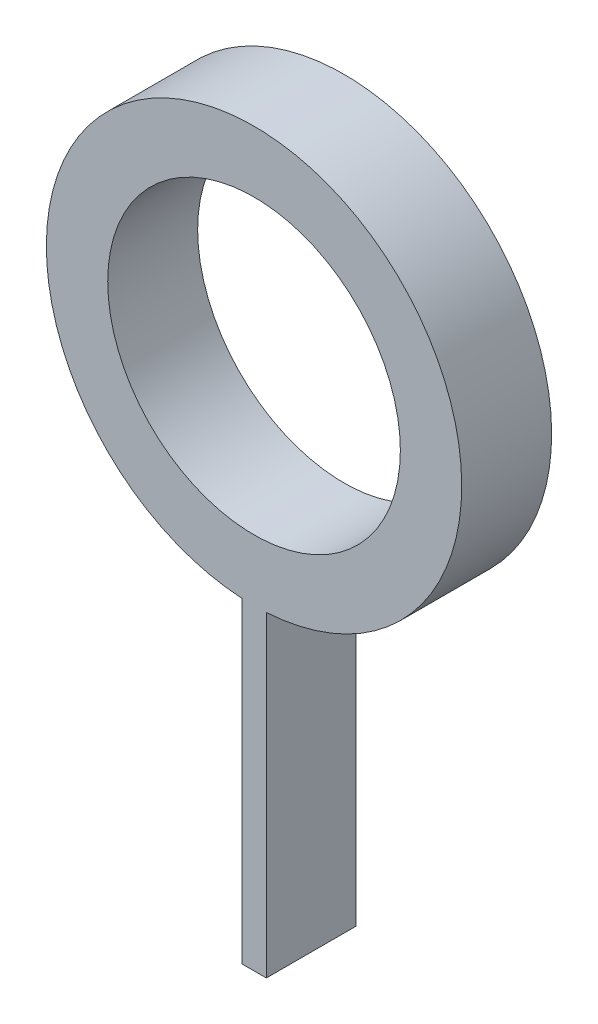
ISO-10303-21;
HEADER;
FILE_DESCRIPTION(('STEP AP214'),'2;1');
FILE_NAME('part.step','',(''),(''),'','','');
FILE_SCHEMA(('AUTOMOTIVE_DESIGN { 1 0 10303 214 1 1 1 1 }'));
ENDSEC;
DATA;
#1=APPLICATION_CONTEXT('core data for automotive mechanical design processes');
#2=APPLICATION_PROTOCOL_DEFINITION('international standard','automotive_design',2000,#1);
#3=PRODUCT_CONTEXT('',#1,'mechanical');
#4=PRODUCT('Part','Part','',(#3));
#5=PRODUCT_RELATED_PRODUCT_CATEGORY('part','',(#4));
#6=PRODUCT_DEFINITION_FORMATION('','',#4);
#7=PRODUCT_DEFINITION_CONTEXT('part definition',#1,'design');
#8=PRODUCT_DEFINITION('design','',#6,#7);
#9=PRODUCT_DEFINITION_SHAPE('','',#8);
#10=(LENGTH_UNIT() NAMED_UNIT(*) SI_UNIT(.MILLI.,.METRE.));
#11=(NAMED_UNIT(*) PLANE_ANGLE_UNIT() SI_UNIT($,.RADIAN.));
#12=(NAMED_UNIT(*) SI_UNIT($,.STERADIAN.) SOLID_ANGLE_UNIT());
#13=UNCERTAINTY_MEASURE_WITH_UNIT(LENGTH_MEASURE(1.E-05),#10,'distance_accuracy_value','');
#14=(GEOMETRIC_REPRESENTATION_CONTEXT(3) GLOBAL_UNCERTAINTY_ASSIGNED_CONTEXT((#13)) GLOBAL_UNIT_ASSIGNED_CONTEXT((#10,
#11,#12)) REPRESENTATION_CONTEXT('',''));
#15=CARTESIAN_POINT('',(0.,0.,0.));
#16=DIRECTION('',(0.,0.,1.));
#17=DIRECTION('',(1.,0.,0.));
#18=AXIS2_PLACEMENT_3D('',#15,#16,#17);
#19=CARTESIAN_POINT('',(0.,-27.75,4.7625));
#20=DIRECTION('',(0.,1.,0.));
#21=DIRECTION('',(0.,0.,1.));
#22=AXIS2_PLACEMENT_3D('',#19,#20,#21);
#23=PLANE('',#22);
#24=DIRECTION('',(1.,0.,0.));
#25=VECTOR('',#24,1.);
#26=CARTESIAN_POINT('',(0.,-27.75,0.));
#27=LINE('',#26,#25);
#28=CARTESIAN_POINT('',(-0.65,-27.75,0.));
#29=VERTEX_POINT('',#28);
#30=CARTESIAN_POINT('',(0.65,-27.75,0.));
#31=VERTEX_POINT('',#30);
#32=EDGE_CURVE('E114',#29,#31,#27,.T.);
#33=ORIENTED_EDGE('',*,*,#32,.T.);
#34=DIRECTION('',(0.,0.,-1.));
#35=VECTOR('',#34,1.);
#36=CARTESIAN_POINT('',(0.65,-27.75,4.7625));
#37=LINE('',#36,#35);
#38=CARTESIAN_POINT('',(0.65,-27.75,4.7625));
#39=VERTEX_POINT('',#38);
#40=EDGE_CURVE('E11',#39,#31,#37,.T.);
#41=ORIENTED_EDGE('',*,*,#40,.F.);
#42=DIRECTION('',(1.,0.,0.));
#43=VECTOR('',#42,1.);
#44=CARTESIAN_POINT('',(0.,-27.75,4.7625));
#45=LINE('',#44,#43);
#46=CARTESIAN_POINT('',(-0.65,-27.75,4.7625));
#47=VERTEX_POINT('',#46);
#48=EDGE_CURVE('E92',#47,#39,#45,.T.);
#49=ORIENTED_EDGE('',*,*,#48,.F.);
#50=DIRECTION('',(0.,0.,-1.));
#51=VECTOR('',#50,1.);
#52=CARTESIAN_POINT('',(-0.65,-27.75,4.7625));
#53=LINE('',#52,#51);
#54=EDGE_CURVE('E58',#47,#29,#53,.T.);
#55=ORIENTED_EDGE('',*,*,#54,.T.);
#56=EDGE_LOOP('',(#33,#41,#49,#55));
#57=FACE_BOUND('',#56,.T.);
#58=ADVANCED_FACE('F41',(#57),#23,.F.);
#59=CARTESIAN_POINT('',(0.650000000000001,0.,4.7625));
#60=DIRECTION('',(-1.,0.,0.));
#61=DIRECTION('',(0.,-1.,0.));
#62=AXIS2_PLACEMENT_3D('',#59,#60,#61);
#63=PLANE('',#62);
#64=DIRECTION('',(0.,1.,0.));
#65=VECTOR('',#64,1.);
#66=CARTESIAN_POINT('',(0.650000000000001,0.,0.));
#67=LINE('',#66,#65);
#68=CARTESIAN_POINT('',(0.650000000000001,-10.9807786609147,0.));
#69=VERTEX_POINT('',#68);
#70=EDGE_CURVE('E98',#31,#69,#67,.T.);
#71=ORIENTED_EDGE('',*,*,#70,.T.);
#72=DIRECTION('',(0.,0.,-1.));
#73=VECTOR('',#72,1.);
#74=CARTESIAN_POINT('',(0.650000000000001,-10.9807786609147,4.7625));
#75=LINE('',#74,#73);
#76=CARTESIAN_POINT('',(0.650000000000001,-10.9807786609147,4.7625));
#77=VERTEX_POINT('',#76);
#78=EDGE_CURVE('E50',#77,#69,#75,.T.);
#79=ORIENTED_EDGE('',*,*,#78,.F.);
#80=DIRECTION('',(0.,1.,0.));
#81=VECTOR('',#80,1.);
#82=CARTESIAN_POINT('',(0.650000000000001,0.,4.7625));
#83=LINE('',#82,#81);
#84=EDGE_CURVE('E84',#39,#77,#83,.T.);
#85=ORIENTED_EDGE('',*,*,#84,.F.);
#86=ORIENTED_EDGE('',*,*,#40,.T.);
#87=EDGE_LOOP('',(#71,#79,#85,#86));
#88=FACE_BOUND('',#87,.T.);
#89=ADVANCED_FACE('F97',(#88),#63,.F.);
#90=CARTESIAN_POINT('',(0.,0.,4.7625));
#91=DIRECTION('',(0.,0.,-1.));
#92=DIRECTION('',(-1.,0.,0.));
#93=AXIS2_PLACEMENT_3D('',#90,#91,#92);
#94=CYLINDRICAL_SURFACE('',#93,11.);
#95=CARTESIAN_POINT('',(0.,0.,0.));
#96=DIRECTION('',(0.,0.,1.));
#97=DIRECTION('',(1.,0.,0.));
#98=AXIS2_PLACEMENT_3D('',#95,#96,#97);
#99=CIRCLE('',#98,11.);
#100=CARTESIAN_POINT('',(-0.65,-10.9807786609147,0.));
#101=VERTEX_POINT('',#100);
#102=EDGE_CURVE('E119',#69,#101,#99,.T.);
#103=ORIENTED_EDGE('',*,*,#102,.T.);
#104=DIRECTION('',(0.,0.,-1.));
#105=VECTOR('',#104,1.);
#106=CARTESIAN_POINT('',(-0.65,-10.9807786609147,4.7625));
#107=LINE('',#106,#105);
#108=CARTESIAN_POINT('',(-0.65,-10.9807786609147,4.7625));
#109=VERTEX_POINT('',#108);
#110=EDGE_CURVE('E73',#109,#101,#107,.T.);
#111=ORIENTED_EDGE('',*,*,#110,.F.);
#112=CARTESIAN_POINT('',(0.,0.,4.7625));
#113=DIRECTION('',(0.,0.,1.));
#114=DIRECTION('',(1.,0.,0.));
#115=AXIS2_PLACEMENT_3D('',#112,#113,#114);
#116=CIRCLE('',#115,11.);
#117=EDGE_CURVE('E91',#77,#109,#116,.T.);
#118=ORIENTED_EDGE('',*,*,#117,.F.);
#119=ORIENTED_EDGE('',*,*,#78,.T.);
#120=EDGE_LOOP('',(#103,#111,#118,#119));
#121=FACE_BOUND('',#120,.T.);
#122=ADVANCED_FACE('F102',(#121),#94,.T.);
#123=CARTESIAN_POINT('',(-0.65,0.,4.7625));
#124=DIRECTION('',(-1.,0.,0.));
#125=DIRECTION('',(0.,-1.,0.));
#126=AXIS2_PLACEMENT_3D('',#123,#124,#125);
#127=PLANE('',#126);
#128=DIRECTION('',(0.,1.,0.));
#129=VECTOR('',#128,1.);
#130=CARTESIAN_POINT('',(-0.65,0.,0.));
#131=LINE('',#130,#129);
#132=EDGE_CURVE('E122',#29,#101,#131,.T.);
#133=ORIENTED_EDGE('',*,*,#132,.F.);
#134=ORIENTED_EDGE('',*,*,#54,.F.);
#135=DIRECTION('',(0.,1.,0.));
#136=VECTOR('',#135,1.);
#137=CARTESIAN_POINT('',(-0.65,0.,4.7625));
#138=LINE('',#137,#136);
#139=EDGE_CURVE('E104',#47,#109,#138,.T.);
#140=ORIENTED_EDGE('',*,*,#139,.T.);
#141=ORIENTED_EDGE('',*,*,#110,.T.);
#142=EDGE_LOOP('',(#133,#134,#140,#141));
#143=FACE_BOUND('',#142,.T.);
#144=ADVANCED_FACE('F140',(#143),#127,.T.);
#145=CARTESIAN_POINT('',(0.,0.,4.7625));
#146=DIRECTION('',(0.,0.,-1.));
#147=DIRECTION('',(-1.,0.,0.));
#148=AXIS2_PLACEMENT_3D('',#145,#146,#147);
#149=CYLINDRICAL_SURFACE('',#148,7.75);
#150=CARTESIAN_POINT('',(0.,0.,4.7625));
#151=DIRECTION('',(0.,0.,1.));
#152=DIRECTION('',(1.,0.,0.));
#153=AXIS2_PLACEMENT_3D('',#150,#151,#152);
#154=CIRCLE('',#153,7.75);
#155=CARTESIAN_POINT('',(-7.75,0.,4.7625));
#156=VERTEX_POINT('',#155);
#157=EDGE_CURVE('E107',#156,#156,#154,.T.);
#158=CARTESIAN_POINT('',(0.,0.,0.));
#159=DIRECTION('',(0.,0.,1.));
#160=DIRECTION('',(1.,0.,0.));
#161=AXIS2_PLACEMENT_3D('',#158,#159,#160);
#162=CIRCLE('',#161,7.75);
#163=CARTESIAN_POINT('',(-7.75,0.,0.));
#164=VERTEX_POINT('',#163);
#165=EDGE_CURVE('E126',#164,#164,#162,.T.);
#166=CARTESIAN_POINT('',(-7.75,0.,4.7625));
#167=CARTESIAN_POINT('',(-7.75,0.,4.712890625));
#168=CARTESIAN_POINT('',(-7.75,0.,4.66328125));
#169=CARTESIAN_POINT('',(-7.75,0.,4.5640625));
#170=CARTESIAN_POINT('',(-7.75,0.,4.514453125));
#171=CARTESIAN_POINT('',(-7.75,0.,4.415234375));
#172=CARTESIAN_POINT('',(-7.75,0.,4.365625));
#173=CARTESIAN_POINT('',(-7.75,0.,4.26640625));
#174=CARTESIAN_POINT('',(-7.75,0.,4.216796875));
#175=CARTESIAN_POINT('',(-7.75,0.,4.117578125));
#176=CARTESIAN_POINT('',(-7.75,0.,4.06796875));
#177=CARTESIAN_POINT('',(-7.75,0.,3.96875));
#178=CARTESIAN_POINT('',(-7.75,0.,3.919140625));
#179=CARTESIAN_POINT('',(-7.75,0.,3.819921875));
#180=CARTESIAN_POINT('',(-7.75,0.,3.7703125));
#181=CARTESIAN_POINT('',(-7.75,0.,3.67109375));
#182=CARTESIAN_POINT('',(-7.75,0.,3.621484375));
#183=CARTESIAN_POINT('',(-7.75,0.,3.522265625));
#184=CARTESIAN_POINT('',(-7.75,0.,3.47265625));
#185=CARTESIAN_POINT('',(-7.75,0.,3.3734375));
#186=CARTESIAN_POINT('',(-7.75,0.,3.323828125));
#187=CARTESIAN_POINT('',(-7.75,0.,3.224609375));
#188=CARTESIAN_POINT('',(-7.75,0.,3.175));
#189=CARTESIAN_POINT('',(-7.75,0.,3.07578125));
#190=CARTESIAN_POINT('',(-7.75,0.,3.026171875));
#191=CARTESIAN_POINT('',(-7.75,0.,2.926953125));
#192=CARTESIAN_POINT('',(-7.75,0.,2.87734375));
#193=CARTESIAN_POINT('',(-7.75,0.,2.778125));
#194=CARTESIAN_POINT('',(-7.75,0.,2.728515625));
#195=CARTESIAN_POINT('',(-7.75,0.,2.629296875));
#196=CARTESIAN_POINT('',(-7.75,0.,2.5796875));
#197=CARTESIAN_POINT('',(-7.75,0.,2.48046875));
#198=CARTESIAN_POINT('',(-7.75,0.,2.430859375));
#199=CARTESIAN_POINT('',(-7.75,0.,2.331640625));
#200=CARTESIAN_POINT('',(-7.75,0.,2.28203125));
#201=CARTESIAN_POINT('',(-7.75,0.,2.1828125));
#202=CARTESIAN_POINT('',(-7.75,0.,2.133203125));
#203=CARTESIAN_POINT('',(-7.75,0.,2.033984375));
#204=CARTESIAN_POINT('',(-7.75,0.,1.984375));
#205=CARTESIAN_POINT('',(-7.75,0.,1.88515625));
#206=CARTESIAN_POINT('',(-7.75,0.,1.835546875));
#207=CARTESIAN_POINT('',(-7.75,0.,1.736328125));
#208=CARTESIAN_POINT('',(-7.75,0.,1.68671875));
#209=CARTESIAN_POINT('',(-7.75,0.,1.5875));
#210=CARTESIAN_POINT('',(-7.75,0.,1.537890625));
#211=CARTESIAN_POINT('',(-7.75,0.,1.438671875));
#212=CARTESIAN_POINT('',(-7.75,0.,1.3890625));
#213=CARTESIAN_POINT('',(-7.75,0.,1.28984375));
#214=CARTESIAN_POINT('',(-7.75,0.,1.240234375));
#215=CARTESIAN_POINT('',(-7.75,0.,1.141015625));
#216=CARTESIAN_POINT('',(-7.75,0.,1.09140625));
#217=CARTESIAN_POINT('',(-7.75,0.,0.9921875));
#218=CARTESIAN_POINT('',(-7.75,0.,0.942578125));
#219=CARTESIAN_POINT('',(-7.75,0.,0.843359375));
#220=CARTESIAN_POINT('',(-7.75,0.,0.79375));
#221=CARTESIAN_POINT('',(-7.75,0.,0.69453125));
#222=CARTESIAN_POINT('',(-7.75,0.,0.644921875));
#223=CARTESIAN_POINT('',(-7.75,0.,0.545703125));
#224=CARTESIAN_POINT('',(-7.75,0.,0.49609375));
#225=CARTESIAN_POINT('',(-7.75,0.,0.396875));
#226=CARTESIAN_POINT('',(-7.75,0.,0.347265625));
#227=CARTESIAN_POINT('',(-7.75,0.,0.248046875));
#228=CARTESIAN_POINT('',(-7.75,0.,0.1984375));
#229=CARTESIAN_POINT('',(-7.75,0.,0.09921875));
#230=CARTESIAN_POINT('',(-7.75,0.,0.049609375));
#231=CARTESIAN_POINT('',(-7.75,0.,0.));
#232=B_SPLINE_CURVE_WITH_KNOTS('',3,(#166,#167,#168,#169,#170,#171,#172,#173,#174,#175,#176,
#177,#178,#179,#180,#181,#182,#183,#184,#185,#186,#187,#188,#189,#190,#191,#192,#193,#194,#195,
#196,#197,#198,#199,#200,#201,#202,#203,#204,#205,#206,#207,#208,#209,#210,#211,#212,#213,#214,
#215,#216,#217,#218,#219,#220,#221,#222,#223,#224,#225,#226,#227,#228,#229,#230,#231),
.UNSPECIFIED.,.F.,.F.,(4,2,2,2,2,2,2,2,2,2,2,2,2,2,2,2,2,2,2,2,2,2,2,2,2,2,2,2,2,2,2,2,4),(0.,
0.148828124999999,0.297656249999999,0.446484374999999,0.595312499999999,0.744140625,0.89296875,
1.041796875,1.190625,1.339453125,1.48828125,1.637109375,1.7859375,1.934765625,2.08359375,
2.232421875,2.38125,2.530078125,2.67890625,2.827734375,2.9765625,3.125390625,3.27421875,
3.423046875,3.571875,3.720703125,3.86953125,4.018359375,4.1671875,4.316015625,4.46484375,
4.613671875,4.7625),.UNSPECIFIED.);
#233=EDGE_CURVE('BSEAM138',#156,#164,#232,.T.);
#234=ORIENTED_EDGE('',*,*,#157,.T.);
#235=ORIENTED_EDGE('',*,*,#165,.F.);
#236=ORIENTED_EDGE('',*,*,#233,.T.);
#237=ORIENTED_EDGE('',*,*,#233,.F.);
#238=EDGE_LOOP('',(#234,#236,#235,#237));
#239=FACE_BOUND('',#238,.T.);
#240=ADVANCED_FACE('F138',(#239),#149,.F.);
#241=CARTESIAN_POINT('',(0.,0.,4.7625));
#242=DIRECTION('',(0.,0.,1.));
#243=DIRECTION('',(1.,0.,0.));
#244=AXIS2_PLACEMENT_3D('',#241,#242,#243);
#245=PLANE('',#244);
#246=ORIENTED_EDGE('',*,*,#48,.T.);
#247=ORIENTED_EDGE('',*,*,#84,.T.);
#248=ORIENTED_EDGE('',*,*,#117,.T.);
#249=ORIENTED_EDGE('',*,*,#139,.F.);
#250=EDGE_LOOP('',(#246,#247,#248,#249));
#251=FACE_BOUND('',#250,.T.);
#252=ORIENTED_EDGE('',*,*,#157,.F.);
#253=EDGE_LOOP('',(#252));
#254=FACE_BOUND('',#253,.T.);
#255=ADVANCED_FACE('F87',(#251,#254),#245,.T.);
#256=CARTESIAN_POINT('',(0.,0.,0.));
#257=DIRECTION('',(0.,0.,1.));
#258=DIRECTION('',(1.,0.,0.));
#259=AXIS2_PLACEMENT_3D('',#256,#257,#258);
#260=PLANE('',#259);
#261=ORIENTED_EDGE('',*,*,#32,.F.);
#262=ORIENTED_EDGE('',*,*,#132,.T.);
#263=ORIENTED_EDGE('',*,*,#102,.F.);
#264=ORIENTED_EDGE('',*,*,#70,.F.);
#265=EDGE_LOOP('',(#261,#262,#263,#264));
#266=FACE_BOUND('',#265,.T.);
#267=ORIENTED_EDGE('',*,*,#165,.T.);
#268=EDGE_LOOP('',(#267));
#269=FACE_BOUND('',#268,.T.);
#270=ADVANCED_FACE('F136',(#266,#269),#260,.F.);
#271=CLOSED_SHELL('',(#58,#89,#122,#144,#240,#255,#270));
#272=MANIFOLD_SOLID_BREP('B2',#271);
#273=ADVANCED_BREP_SHAPE_REPRESENTATION('',(#18,#272),#14);
#274=SHAPE_DEFINITION_REPRESENTATION(#9,#273);
ENDSEC;
END-ISO-10303-21;
